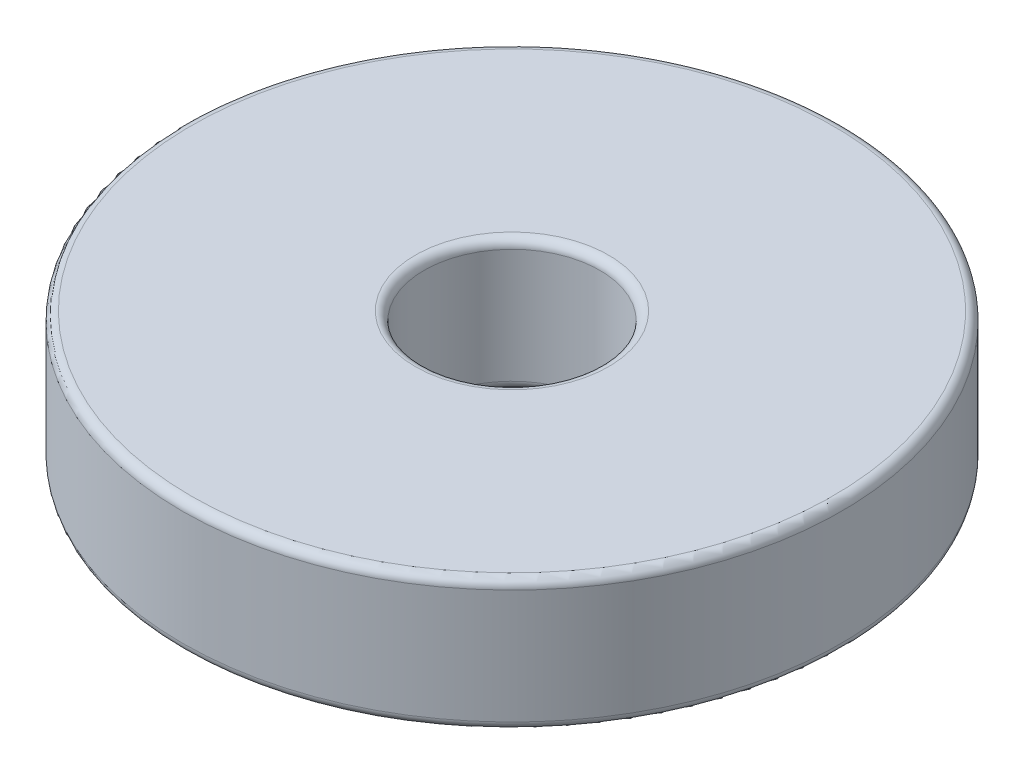
ISO-10303-21;
HEADER;
FILE_DESCRIPTION(('STEP AP214'),'2;1');
FILE_NAME('part.step','',(''),(''),'','','');
FILE_SCHEMA(('AUTOMOTIVE_DESIGN { 1 0 10303 214 1 1 1 1 }'));
ENDSEC;
DATA;
#1=APPLICATION_CONTEXT('core data for automotive mechanical design processes');
#2=APPLICATION_PROTOCOL_DEFINITION('international standard','automotive_design',2000,#1);
#3=PRODUCT_CONTEXT('',#1,'mechanical');
#4=PRODUCT('Part','Part','',(#3));
#5=PRODUCT_RELATED_PRODUCT_CATEGORY('part','',(#4));
#6=PRODUCT_DEFINITION_FORMATION('','',#4);
#7=PRODUCT_DEFINITION_CONTEXT('part definition',#1,'design');
#8=PRODUCT_DEFINITION('design','',#6,#7);
#9=PRODUCT_DEFINITION_SHAPE('','',#8);
#10=(LENGTH_UNIT() NAMED_UNIT(*) SI_UNIT(.MILLI.,.METRE.));
#11=(NAMED_UNIT(*) PLANE_ANGLE_UNIT() SI_UNIT($,.RADIAN.));
#12=(NAMED_UNIT(*) SI_UNIT($,.STERADIAN.) SOLID_ANGLE_UNIT());
#13=UNCERTAINTY_MEASURE_WITH_UNIT(LENGTH_MEASURE(1.E-05),#10,'distance_accuracy_value','');
#14=(GEOMETRIC_REPRESENTATION_CONTEXT(3) GLOBAL_UNCERTAINTY_ASSIGNED_CONTEXT((#13)) GLOBAL_UNIT_ASSIGNED_CONTEXT((#10,
#11,#12)) REPRESENTATION_CONTEXT('',''));
#15=CARTESIAN_POINT('',(0.,0.,0.));
#16=DIRECTION('',(0.,0.,1.));
#17=DIRECTION('',(1.,0.,0.));
#18=AXIS2_PLACEMENT_3D('',#15,#16,#17);
#19=CARTESIAN_POINT('',(0.,3.,0.));
#20=DIRECTION('',(0.,1.,0.));
#21=DIRECTION('',(0.,0.,1.));
#22=AXIS2_PLACEMENT_3D('',#19,#20,#21);
#23=PLANE('',#22);
#24=CARTESIAN_POINT('',(0.,3.,0.));
#25=DIRECTION('',(0.,1.,0.));
#26=DIRECTION('',(0.,0.,1.));
#27=AXIS2_PLACEMENT_3D('',#24,#25,#26);
#28=CIRCLE('',#27,2.2);
#29=CARTESIAN_POINT('',(0.,3.,2.2));
#30=VERTEX_POINT('',#29);
#31=EDGE_CURVE('E10',#30,#30,#28,.F.);
#32=ORIENTED_EDGE('',*,*,#31,.T.);
#33=EDGE_LOOP('',(#32));
#34=FACE_BOUND('',#33,.T.);
#35=CARTESIAN_POINT('',(0.,3.,0.));
#36=DIRECTION('',(0.,1.,0.));
#37=DIRECTION('',(0.,0.,1.));
#38=AXIS2_PLACEMENT_3D('',#35,#36,#37);
#39=CIRCLE('',#38,7.3);
#40=CARTESIAN_POINT('',(0.,3.,7.3));
#41=VERTEX_POINT('',#40);
#42=EDGE_CURVE('E38',#41,#41,#39,.T.);
#43=ORIENTED_EDGE('',*,*,#42,.T.);
#44=EDGE_LOOP('',(#43));
#45=FACE_BOUND('',#44,.T.);
#46=ADVANCED_FACE('F31',(#34,#45),#23,.T.);
#47=CARTESIAN_POINT('',(0.,0.,0.));
#48=DIRECTION('',(0.,1.,0.));
#49=DIRECTION('',(0.,0.,1.));
#50=AXIS2_PLACEMENT_3D('',#47,#48,#49);
#51=PLANE('',#50);
#52=CARTESIAN_POINT('',(0.,0.,0.));
#53=DIRECTION('',(0.,1.,0.));
#54=DIRECTION('',(0.,0.,1.));
#55=AXIS2_PLACEMENT_3D('',#52,#53,#54);
#56=CIRCLE('',#55,2.2);
#57=CARTESIAN_POINT('',(0.,0.,2.2));
#58=VERTEX_POINT('',#57);
#59=EDGE_CURVE('E57',#58,#58,#56,.T.);
#60=ORIENTED_EDGE('',*,*,#59,.T.);
#61=EDGE_LOOP('',(#60));
#62=FACE_BOUND('',#61,.T.);
#63=CARTESIAN_POINT('',(0.,0.,0.));
#64=DIRECTION('',(0.,1.,0.));
#65=DIRECTION('',(0.,0.,1.));
#66=AXIS2_PLACEMENT_3D('',#63,#64,#65);
#67=CIRCLE('',#66,7.3);
#68=CARTESIAN_POINT('',(0.,0.,7.3));
#69=VERTEX_POINT('',#68);
#70=EDGE_CURVE('E60',#69,#69,#67,.F.);
#71=ORIENTED_EDGE('',*,*,#70,.T.);
#72=EDGE_LOOP('',(#71));
#73=FACE_BOUND('',#72,.T.);
#74=ADVANCED_FACE('F64',(#62,#73),#51,.F.);
#75=CARTESIAN_POINT('',(0.,3.,0.));
#76=DIRECTION('',(0.,-1.,0.));
#77=DIRECTION('',(0.,0.,-1.));
#78=AXIS2_PLACEMENT_3D('',#75,#76,#77);
#79=CYLINDRICAL_SURFACE('',#78,7.5);
#80=CARTESIAN_POINT('',(0.,0.2,0.));
#81=DIRECTION('',(0.,1.,0.));
#82=DIRECTION('',(0.,0.,1.));
#83=AXIS2_PLACEMENT_3D('',#80,#81,#82);
#84=CIRCLE('',#83,7.5);
#85=CARTESIAN_POINT('',(0.,0.2,7.5));
#86=VERTEX_POINT('',#85);
#87=EDGE_CURVE('E42',#86,#86,#84,.T.);
#88=ORIENTED_EDGE('',*,*,#87,.T.);
#89=EDGE_LOOP('',(#88));
#90=FACE_BOUND('',#89,.T.);
#91=CARTESIAN_POINT('',(0.,2.8,0.));
#92=DIRECTION('',(0.,1.,0.));
#93=DIRECTION('',(0.,0.,1.));
#94=AXIS2_PLACEMENT_3D('',#91,#92,#93);
#95=CIRCLE('',#94,7.5);
#96=CARTESIAN_POINT('',(0.,2.8,7.5));
#97=VERTEX_POINT('',#96);
#98=EDGE_CURVE('E46',#97,#97,#95,.F.);
#99=ORIENTED_EDGE('',*,*,#98,.T.);
#100=EDGE_LOOP('',(#99));
#101=FACE_BOUND('',#100,.T.);
#102=ADVANCED_FACE('F74',(#90,#101),#79,.T.);
#103=CARTESIAN_POINT('',(0.,3.,0.));
#104=DIRECTION('',(0.,-1.,0.));
#105=DIRECTION('',(0.,0.,-1.));
#106=AXIS2_PLACEMENT_3D('',#103,#104,#105);
#107=CYLINDRICAL_SURFACE('',#106,2.);
#108=CARTESIAN_POINT('',(0.,0.2,0.));
#109=DIRECTION('',(0.,1.,0.));
#110=DIRECTION('',(0.,0.,1.));
#111=AXIS2_PLACEMENT_3D('',#108,#109,#110);
#112=CIRCLE('',#111,2.);
#113=CARTESIAN_POINT('',(0.,0.2,2.));
#114=VERTEX_POINT('',#113);
#115=EDGE_CURVE('E51',#114,#114,#112,.F.);
#116=ORIENTED_EDGE('',*,*,#115,.T.);
#117=EDGE_LOOP('',(#116));
#118=FACE_BOUND('',#117,.T.);
#119=CARTESIAN_POINT('',(0.,2.8,0.));
#120=DIRECTION('',(0.,1.,0.));
#121=DIRECTION('',(0.,0.,1.));
#122=AXIS2_PLACEMENT_3D('',#119,#120,#121);
#123=CIRCLE('',#122,2.);
#124=CARTESIAN_POINT('',(0.,2.8,2.));
#125=VERTEX_POINT('',#124);
#126=EDGE_CURVE('E54',#125,#125,#123,.T.);
#127=ORIENTED_EDGE('',*,*,#126,.T.);
#128=EDGE_LOOP('',(#127));
#129=FACE_BOUND('',#128,.T.);
#130=ADVANCED_FACE('F77',(#118,#129),#107,.F.);
#131=CARTESIAN_POINT('',(0.,0.2,0.));
#132=DIRECTION('',(0.,1.,0.));
#133=DIRECTION('',(0.,0.,1.));
#134=AXIS2_PLACEMENT_3D('',#131,#132,#133);
#135=TOROIDAL_SURFACE('',#134,2.2,0.2);
#136=ORIENTED_EDGE('',*,*,#115,.F.);
#137=EDGE_LOOP('',(#136));
#138=FACE_BOUND('',#137,.T.);
#139=ORIENTED_EDGE('',*,*,#59,.F.);
#140=EDGE_LOOP('',(#139));
#141=FACE_BOUND('',#140,.T.);
#142=ADVANCED_FACE('F70',(#138,#141),#135,.T.);
#143=CARTESIAN_POINT('',(0.,0.2,0.));
#144=DIRECTION('',(0.,1.,0.));
#145=DIRECTION('',(0.,0.,1.));
#146=AXIS2_PLACEMENT_3D('',#143,#144,#145);
#147=TOROIDAL_SURFACE('',#146,7.3,0.2);
#148=ORIENTED_EDGE('',*,*,#70,.F.);
#149=EDGE_LOOP('',(#148));
#150=FACE_BOUND('',#149,.T.);
#151=ORIENTED_EDGE('',*,*,#87,.F.);
#152=EDGE_LOOP('',(#151));
#153=FACE_BOUND('',#152,.T.);
#154=ADVANCED_FACE('F66',(#150,#153),#147,.T.);
#155=CARTESIAN_POINT('',(0.,2.8,0.));
#156=DIRECTION('',(0.,1.,0.));
#157=DIRECTION('',(0.,0.,1.));
#158=AXIS2_PLACEMENT_3D('',#155,#156,#157);
#159=TOROIDAL_SURFACE('',#158,2.2,0.2);
#160=ORIENTED_EDGE('',*,*,#31,.F.);
#161=EDGE_LOOP('',(#160));
#162=FACE_BOUND('',#161,.T.);
#163=ORIENTED_EDGE('',*,*,#126,.F.);
#164=EDGE_LOOP('',(#163));
#165=FACE_BOUND('',#164,.T.);
#166=ADVANCED_FACE('F69',(#162,#165),#159,.T.);
#167=CARTESIAN_POINT('',(0.,2.8,0.));
#168=DIRECTION('',(0.,1.,0.));
#169=DIRECTION('',(0.,0.,1.));
#170=AXIS2_PLACEMENT_3D('',#167,#168,#169);
#171=TOROIDAL_SURFACE('',#170,7.3,0.2);
#172=ORIENTED_EDGE('',*,*,#98,.F.);
#173=EDGE_LOOP('',(#172));
#174=FACE_BOUND('',#173,.T.);
#175=ORIENTED_EDGE('',*,*,#42,.F.);
#176=EDGE_LOOP('',(#175));
#177=FACE_BOUND('',#176,.T.);
#178=ADVANCED_FACE('F33',(#174,#177),#171,.T.);
#179=CLOSED_SHELL('',(#46,#74,#102,#130,#142,#154,#166,#178));
#180=MANIFOLD_SOLID_BREP('B2',#179);
#181=ADVANCED_BREP_SHAPE_REPRESENTATION('',(#18,#180),#14);
#182=SHAPE_DEFINITION_REPRESENTATION(#9,#181);
ENDSEC;
END-ISO-10303-21;
